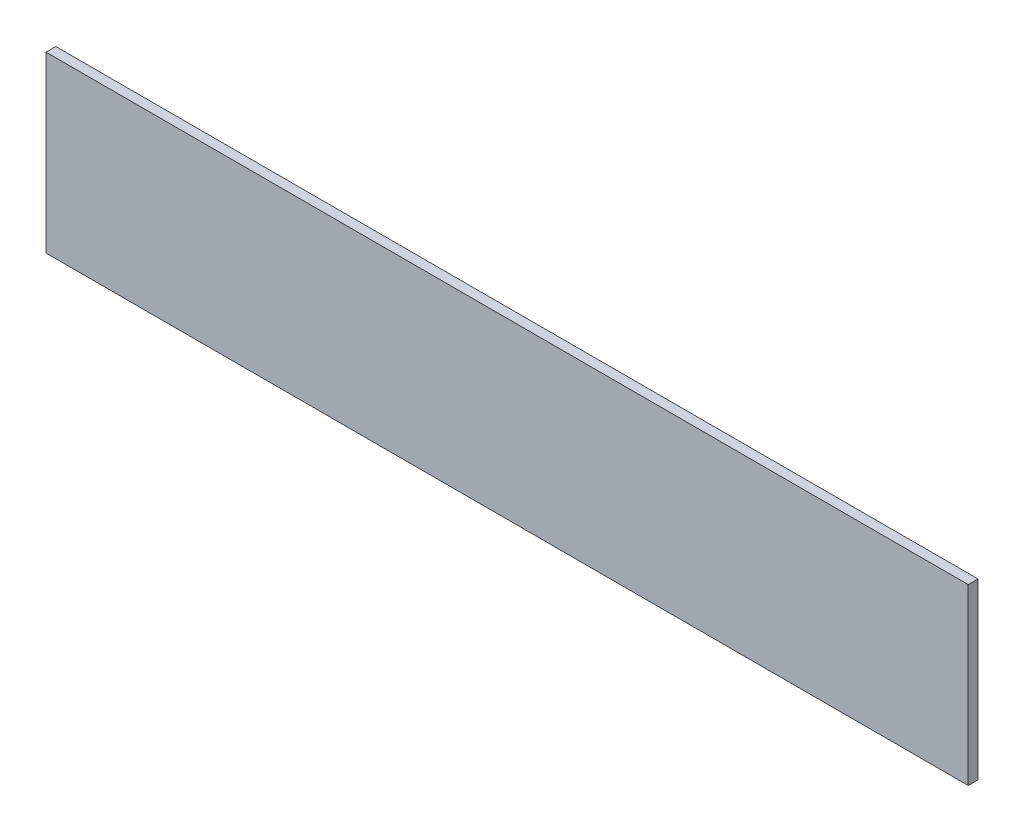
ISO-10303-21;
HEADER;
FILE_DESCRIPTION(('STEP AP214'),'2;1');
FILE_NAME('part.step','',(''),(''),'','','');
FILE_SCHEMA(('AUTOMOTIVE_DESIGN { 1 0 10303 214 1 1 1 1 }'));
ENDSEC;
DATA;
#1=APPLICATION_CONTEXT('core data for automotive mechanical design processes');
#2=APPLICATION_PROTOCOL_DEFINITION('international standard','automotive_design',2000,#1);
#3=PRODUCT_CONTEXT('',#1,'mechanical');
#4=PRODUCT('Part','Part','',(#3));
#5=PRODUCT_RELATED_PRODUCT_CATEGORY('part','',(#4));
#6=PRODUCT_DEFINITION_FORMATION('','',#4);
#7=PRODUCT_DEFINITION_CONTEXT('part definition',#1,'design');
#8=PRODUCT_DEFINITION('design','',#6,#7);
#9=PRODUCT_DEFINITION_SHAPE('','',#8);
#10=(LENGTH_UNIT() NAMED_UNIT(*) SI_UNIT(.MILLI.,.METRE.));
#11=(NAMED_UNIT(*) PLANE_ANGLE_UNIT() SI_UNIT($,.RADIAN.));
#12=(NAMED_UNIT(*) SI_UNIT($,.STERADIAN.) SOLID_ANGLE_UNIT());
#13=UNCERTAINTY_MEASURE_WITH_UNIT(LENGTH_MEASURE(1.E-05),#10,'distance_accuracy_value','');
#14=(GEOMETRIC_REPRESENTATION_CONTEXT(3) GLOBAL_UNCERTAINTY_ASSIGNED_CONTEXT((#13)) GLOBAL_UNIT_ASSIGNED_CONTEXT((#10,
#11,#12)) REPRESENTATION_CONTEXT('',''));
#15=CARTESIAN_POINT('',(0.,0.,0.));
#16=DIRECTION('',(0.,0.,1.));
#17=DIRECTION('',(1.,0.,0.));
#18=AXIS2_PLACEMENT_3D('',#15,#16,#17);
#19=CARTESIAN_POINT('',(149.85,28.275,3.175));
#20=DIRECTION('',(-1.,0.,0.));
#21=DIRECTION('',(0.,0.,1.));
#22=AXIS2_PLACEMENT_3D('',#19,#20,#21);
#23=PLANE('',#22);
#24=DIRECTION('',(0.,1.,0.));
#25=VECTOR('',#24,1.);
#26=CARTESIAN_POINT('',(149.85,28.275,0.));
#27=LINE('',#26,#25);
#28=CARTESIAN_POINT('',(149.85,-28.275,0.));
#29=VERTEX_POINT('',#28);
#30=CARTESIAN_POINT('',(149.85,28.275,0.));
#31=VERTEX_POINT('',#30);
#32=EDGE_CURVE('E106',#29,#31,#27,.T.);
#33=ORIENTED_EDGE('',*,*,#32,.T.);
#34=DIRECTION('',(0.,0.,-1.));
#35=VECTOR('',#34,1.);
#36=CARTESIAN_POINT('',(149.85,28.275,3.175));
#37=LINE('',#36,#35);
#38=CARTESIAN_POINT('',(149.85,28.275,3.175));
#39=VERTEX_POINT('',#38);
#40=EDGE_CURVE('E11',#39,#31,#37,.T.);
#41=ORIENTED_EDGE('',*,*,#40,.F.);
#42=DIRECTION('',(0.,1.,0.));
#43=VECTOR('',#42,1.);
#44=CARTESIAN_POINT('',(149.85,28.275,3.175));
#45=LINE('',#44,#43);
#46=CARTESIAN_POINT('',(149.85,-28.275,3.175));
#47=VERTEX_POINT('',#46);
#48=EDGE_CURVE('E94',#47,#39,#45,.T.);
#49=ORIENTED_EDGE('',*,*,#48,.F.);
#50=DIRECTION('',(0.,0.,-1.));
#51=VECTOR('',#50,1.);
#52=CARTESIAN_POINT('',(149.85,-28.275,3.175));
#53=LINE('',#52,#51);
#54=EDGE_CURVE('E102',#47,#29,#53,.T.);
#55=ORIENTED_EDGE('',*,*,#54,.T.);
#56=EDGE_LOOP('',(#33,#41,#49,#55));
#57=FACE_BOUND('',#56,.T.);
#58=ADVANCED_FACE('F43',(#57),#23,.F.);
#59=CARTESIAN_POINT('',(-149.85,28.275,3.175));
#60=DIRECTION('',(0.,-1.,0.));
#61=DIRECTION('',(0.,0.,-1.));
#62=AXIS2_PLACEMENT_3D('',#59,#60,#61);
#63=PLANE('',#62);
#64=DIRECTION('',(-1.,0.,0.));
#65=VECTOR('',#64,1.);
#66=CARTESIAN_POINT('',(-149.85,28.275,0.));
#67=LINE('',#66,#65);
#68=CARTESIAN_POINT('',(-149.85,28.275,0.));
#69=VERTEX_POINT('',#68);
#70=EDGE_CURVE('E98',#31,#69,#67,.T.);
#71=ORIENTED_EDGE('',*,*,#70,.T.);
#72=DIRECTION('',(0.,0.,-1.));
#73=VECTOR('',#72,1.);
#74=CARTESIAN_POINT('',(-149.85,28.275,3.175));
#75=LINE('',#74,#73);
#76=CARTESIAN_POINT('',(-149.85,28.275,3.175));
#77=VERTEX_POINT('',#76);
#78=EDGE_CURVE('E51',#77,#69,#75,.T.);
#79=ORIENTED_EDGE('',*,*,#78,.F.);
#80=DIRECTION('',(-1.,0.,0.));
#81=VECTOR('',#80,1.);
#82=CARTESIAN_POINT('',(-149.85,28.275,3.175));
#83=LINE('',#82,#81);
#84=EDGE_CURVE('E89',#39,#77,#83,.T.);
#85=ORIENTED_EDGE('',*,*,#84,.F.);
#86=ORIENTED_EDGE('',*,*,#40,.T.);
#87=EDGE_LOOP('',(#71,#79,#85,#86));
#88=FACE_BOUND('',#87,.T.);
#89=ADVANCED_FACE('F97',(#88),#63,.F.);
#90=CARTESIAN_POINT('',(-149.85,28.275,3.175));
#91=DIRECTION('',(1.,0.,0.));
#92=DIRECTION('',(0.,0.,-1.));
#93=AXIS2_PLACEMENT_3D('',#90,#91,#92);
#94=PLANE('',#93);
#95=DIRECTION('',(0.,-1.,0.));
#96=VECTOR('',#95,1.);
#97=CARTESIAN_POINT('',(-149.85,28.275,0.));
#98=LINE('',#97,#96);
#99=CARTESIAN_POINT('',(-149.85,-28.275,0.));
#100=VERTEX_POINT('',#99);
#101=EDGE_CURVE('E76',#69,#100,#98,.T.);
#102=ORIENTED_EDGE('',*,*,#101,.T.);
#103=DIRECTION('',(0.,0.,-1.));
#104=VECTOR('',#103,1.);
#105=CARTESIAN_POINT('',(-149.85,-28.275,3.175));
#106=LINE('',#105,#104);
#107=CARTESIAN_POINT('',(-149.85,-28.275,3.175));
#108=VERTEX_POINT('',#107);
#109=EDGE_CURVE('E99',#108,#100,#106,.T.);
#110=ORIENTED_EDGE('',*,*,#109,.F.);
#111=DIRECTION('',(0.,-1.,0.));
#112=VECTOR('',#111,1.);
#113=CARTESIAN_POINT('',(-149.85,28.275,3.175));
#114=LINE('',#113,#112);
#115=EDGE_CURVE('E92',#77,#108,#114,.T.);
#116=ORIENTED_EDGE('',*,*,#115,.F.);
#117=ORIENTED_EDGE('',*,*,#78,.T.);
#118=EDGE_LOOP('',(#102,#110,#116,#117));
#119=FACE_BOUND('',#118,.T.);
#120=ADVANCED_FACE('F100',(#119),#94,.F.);
#121=CARTESIAN_POINT('',(-149.85,-28.275,3.175));
#122=DIRECTION('',(0.,1.,0.));
#123=DIRECTION('',(0.,0.,1.));
#124=AXIS2_PLACEMENT_3D('',#121,#122,#123);
#125=PLANE('',#124);
#126=DIRECTION('',(1.,0.,0.));
#127=VECTOR('',#126,1.);
#128=CARTESIAN_POINT('',(-149.85,-28.275,0.));
#129=LINE('',#128,#127);
#130=EDGE_CURVE('E82',#100,#29,#129,.T.);
#131=ORIENTED_EDGE('',*,*,#130,.T.);
#132=ORIENTED_EDGE('',*,*,#54,.F.);
#133=DIRECTION('',(1.,0.,0.));
#134=VECTOR('',#133,1.);
#135=CARTESIAN_POINT('',(-149.85,-28.275,3.175));
#136=LINE('',#135,#134);
#137=EDGE_CURVE('E59',#108,#47,#136,.T.);
#138=ORIENTED_EDGE('',*,*,#137,.F.);
#139=ORIENTED_EDGE('',*,*,#109,.T.);
#140=EDGE_LOOP('',(#131,#132,#138,#139));
#141=FACE_BOUND('',#140,.T.);
#142=ADVANCED_FACE('F113',(#141),#125,.F.);
#143=CARTESIAN_POINT('',(0.,0.,3.175));
#144=DIRECTION('',(0.,0.,1.));
#145=DIRECTION('',(1.,0.,0.));
#146=AXIS2_PLACEMENT_3D('',#143,#144,#145);
#147=PLANE('',#146);
#148=ORIENTED_EDGE('',*,*,#48,.T.);
#149=ORIENTED_EDGE('',*,*,#84,.T.);
#150=ORIENTED_EDGE('',*,*,#115,.T.);
#151=ORIENTED_EDGE('',*,*,#137,.T.);
#152=EDGE_LOOP('',(#148,#149,#150,#151));
#153=FACE_BOUND('',#152,.T.);
#154=ADVANCED_FACE('F90',(#153),#147,.T.);
#155=CARTESIAN_POINT('',(0.,0.,0.));
#156=DIRECTION('',(0.,0.,1.));
#157=DIRECTION('',(1.,0.,0.));
#158=AXIS2_PLACEMENT_3D('',#155,#156,#157);
#159=PLANE('',#158);
#160=ORIENTED_EDGE('',*,*,#32,.F.);
#161=ORIENTED_EDGE('',*,*,#130,.F.);
#162=ORIENTED_EDGE('',*,*,#101,.F.);
#163=ORIENTED_EDGE('',*,*,#70,.F.);
#164=EDGE_LOOP('',(#160,#161,#162,#163));
#165=FACE_BOUND('',#164,.T.);
#166=ADVANCED_FACE('F116',(#165),#159,.F.);
#167=CLOSED_SHELL('',(#58,#89,#120,#142,#154,#166));
#168=MANIFOLD_SOLID_BREP('B2',#167);
#169=ADVANCED_BREP_SHAPE_REPRESENTATION('',(#18,#168),#14);
#170=SHAPE_DEFINITION_REPRESENTATION(#9,#169);
ENDSEC;
END-ISO-10303-21;
